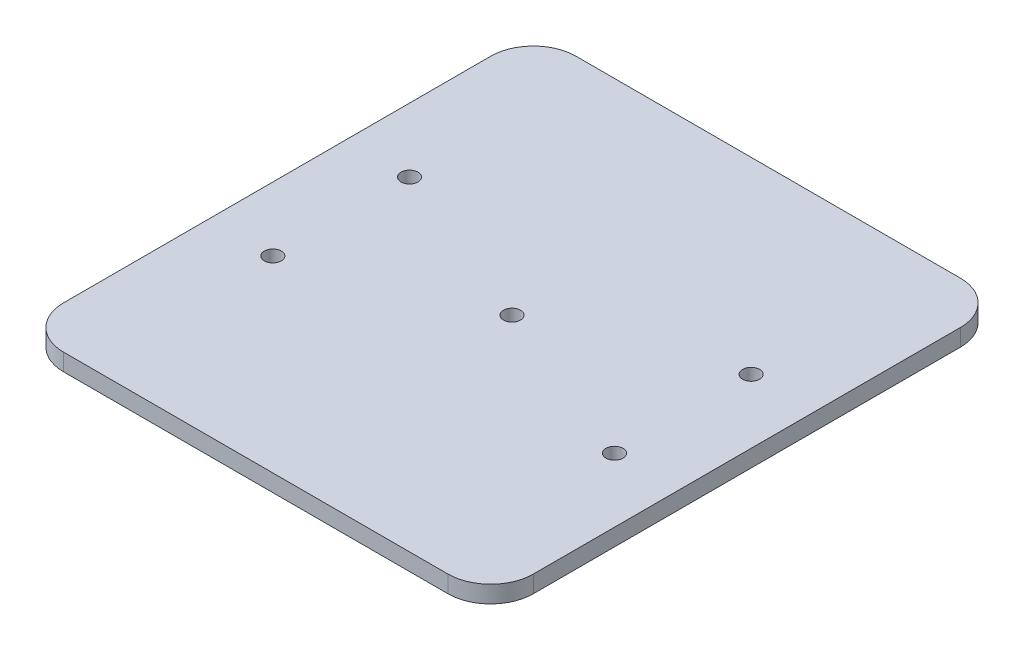
ISO-10303-21;
HEADER;
FILE_DESCRIPTION(('STEP AP214'),'2;1');
FILE_NAME('part.step','',(''),(''),'','','');
FILE_SCHEMA(('AUTOMOTIVE_DESIGN { 1 0 10303 214 1 1 1 1 }'));
ENDSEC;
DATA;
#1=APPLICATION_CONTEXT('core data for automotive mechanical design processes');
#2=APPLICATION_PROTOCOL_DEFINITION('international standard','automotive_design',2000,#1);
#3=PRODUCT_CONTEXT('',#1,'mechanical');
#4=PRODUCT('Part','Part','',(#3));
#5=PRODUCT_RELATED_PRODUCT_CATEGORY('part','',(#4));
#6=PRODUCT_DEFINITION_FORMATION('','',#4);
#7=PRODUCT_DEFINITION_CONTEXT('part definition',#1,'design');
#8=PRODUCT_DEFINITION('design','',#6,#7);
#9=PRODUCT_DEFINITION_SHAPE('','',#8);
#10=(LENGTH_UNIT() NAMED_UNIT(*) SI_UNIT(.MILLI.,.METRE.));
#11=(NAMED_UNIT(*) PLANE_ANGLE_UNIT() SI_UNIT($,.RADIAN.));
#12=(NAMED_UNIT(*) SI_UNIT($,.STERADIAN.) SOLID_ANGLE_UNIT());
#13=UNCERTAINTY_MEASURE_WITH_UNIT(LENGTH_MEASURE(1.E-05),#10,'distance_accuracy_value','');
#14=(GEOMETRIC_REPRESENTATION_CONTEXT(3) GLOBAL_UNCERTAINTY_ASSIGNED_CONTEXT((#13)) GLOBAL_UNIT_ASSIGNED_CONTEXT((#10,
#11,#12)) REPRESENTATION_CONTEXT('',''));
#15=CARTESIAN_POINT('',(0.,0.,0.));
#16=DIRECTION('',(0.,0.,1.));
#17=DIRECTION('',(1.,0.,0.));
#18=AXIS2_PLACEMENT_3D('',#15,#16,#17);
#19=CARTESIAN_POINT('',(8.19905213270141,2.,25.1421800947867));
#20=DIRECTION('',(0.,1.,0.));
#21=DIRECTION('',(0.,0.,1.));
#22=AXIS2_PLACEMENT_3D('',#19,#20,#21);
#23=PLANE('',#22);
#24=CARTESIAN_POINT('',(5.69905213270141,2.,-7.85781990521327));
#25=DIRECTION('',(0.,1.,0.));
#26=DIRECTION('',(0.,0.,1.));
#27=AXIS2_PLACEMENT_3D('',#24,#25,#26);
#28=CIRCLE('',#27,1.);
#29=CARTESIAN_POINT('',(5.69905213270141,2.,-6.85781990521327));
#30=VERTEX_POINT('',#29);
#31=EDGE_CURVE('E232',#30,#30,#28,.F.);
#32=ORIENTED_EDGE('',*,*,#31,.T.);
#33=EDGE_LOOP('',(#32));
#34=FACE_BOUND('',#33,.T.);
#35=CARTESIAN_POINT('',(5.69905213270141,2.,8.14218009478673));
#36=DIRECTION('',(0.,1.,0.));
#37=DIRECTION('',(0.,0.,1.));
#38=AXIS2_PLACEMENT_3D('',#35,#36,#37);
#39=CIRCLE('',#38,1.);
#40=CARTESIAN_POINT('',(5.69905213270141,2.,9.14218009478673));
#41=VERTEX_POINT('',#40);
#42=EDGE_CURVE('E239',#41,#41,#39,.F.);
#43=ORIENTED_EDGE('',*,*,#42,.T.);
#44=EDGE_LOOP('',(#43));
#45=FACE_BOUND('',#44,.T.);
#46=CARTESIAN_POINT('',(-34.3009478672986,2.,8.14218009478673));
#47=DIRECTION('',(0.,1.,0.));
#48=DIRECTION('',(0.,0.,1.));
#49=AXIS2_PLACEMENT_3D('',#46,#47,#48);
#50=CIRCLE('',#49,0.999999999999998);
#51=CARTESIAN_POINT('',(-34.3009478672986,2.,9.14218009478673));
#52=VERTEX_POINT('',#51);
#53=EDGE_CURVE('E216',#52,#52,#50,.T.);
#54=ORIENTED_EDGE('',*,*,#53,.F.);
#55=EDGE_LOOP('',(#54));
#56=FACE_BOUND('',#55,.T.);
#57=CARTESIAN_POINT('',(8.19905213270141,2.,25.1421800947867));
#58=DIRECTION('',(0.,1.,0.));
#59=DIRECTION('',(0.,0.,1.));
#60=AXIS2_PLACEMENT_3D('',#57,#58,#59);
#61=CIRCLE('',#60,5.);
#62=CARTESIAN_POINT('',(8.19905213270137,2.,30.1421800947867));
#63=VERTEX_POINT('',#62);
#64=CARTESIAN_POINT('',(13.1990521327014,2.,25.1421800947867));
#65=VERTEX_POINT('',#64);
#66=EDGE_CURVE('E167',#63,#65,#61,.T.);
#67=ORIENTED_EDGE('',*,*,#66,.T.);
#68=DIRECTION('',(0.,0.,-1.));
#69=VECTOR('',#68,1.);
#70=CARTESIAN_POINT('',(13.1990521327014,2.,-24.8578199052132));
#71=LINE('',#70,#69);
#72=CARTESIAN_POINT('',(13.1990521327014,2.,-24.8578199052132));
#73=VERTEX_POINT('',#72);
#74=EDGE_CURVE('E103',#65,#73,#71,.T.);
#75=ORIENTED_EDGE('',*,*,#74,.T.);
#76=CARTESIAN_POINT('',(8.19905213270141,2.,-24.8578199052133));
#77=DIRECTION('',(0.,1.,0.));
#78=DIRECTION('',(0.,0.,-1.));
#79=AXIS2_PLACEMENT_3D('',#76,#77,#78);
#80=CIRCLE('',#79,5.);
#81=CARTESIAN_POINT('',(8.19905213270137,2.,-29.8578199052133));
#82=VERTEX_POINT('',#81);
#83=EDGE_CURVE('E188',#73,#82,#80,.T.);
#84=ORIENTED_EDGE('',*,*,#83,.T.);
#85=DIRECTION('',(-1.,0.,0.));
#86=VECTOR('',#85,1.);
#87=CARTESIAN_POINT('',(-36.8009478672986,2.,-29.8578199052133));
#88=LINE('',#87,#86);
#89=CARTESIAN_POINT('',(-36.8009478672986,2.,-29.8578199052133));
#90=VERTEX_POINT('',#89);
#91=EDGE_CURVE('E202',#82,#90,#88,.T.);
#92=ORIENTED_EDGE('',*,*,#91,.T.);
#93=CARTESIAN_POINT('',(-36.8009478672986,2.,-24.8578199052133));
#94=DIRECTION('',(0.,1.,0.));
#95=DIRECTION('',(0.,0.,-1.));
#96=AXIS2_PLACEMENT_3D('',#93,#94,#95);
#97=CIRCLE('',#96,5.);
#98=CARTESIAN_POINT('',(-41.8009478672986,2.,-24.8578199052132));
#99=VERTEX_POINT('',#98);
#100=EDGE_CURVE('E122',#90,#99,#97,.T.);
#101=ORIENTED_EDGE('',*,*,#100,.T.);
#102=DIRECTION('',(0.,0.,1.));
#103=VECTOR('',#102,1.);
#104=CARTESIAN_POINT('',(-41.8009478672986,2.,-24.8578199052132));
#105=LINE('',#104,#103);
#106=CARTESIAN_POINT('',(-41.8009478672986,2.,25.1421800947867));
#107=VERTEX_POINT('',#106);
#108=EDGE_CURVE('E116',#99,#107,#105,.T.);
#109=ORIENTED_EDGE('',*,*,#108,.T.);
#110=CARTESIAN_POINT('',(-36.8009478672986,2.,25.1421800947867));
#111=DIRECTION('',(0.,1.,0.));
#112=DIRECTION('',(0.,0.,1.));
#113=AXIS2_PLACEMENT_3D('',#110,#111,#112);
#114=CIRCLE('',#113,5.);
#115=CARTESIAN_POINT('',(-36.8009478672986,2.,30.1421800947867));
#116=VERTEX_POINT('',#115);
#117=EDGE_CURVE('E120',#107,#116,#114,.T.);
#118=ORIENTED_EDGE('',*,*,#117,.T.);
#119=DIRECTION('',(1.,0.,0.));
#120=VECTOR('',#119,1.);
#121=CARTESIAN_POINT('',(-36.8009478672986,2.,30.1421800947867));
#122=LINE('',#121,#120);
#123=EDGE_CURVE('E60',#116,#63,#122,.T.);
#124=ORIENTED_EDGE('',*,*,#123,.T.);
#125=EDGE_LOOP('',(#67,#75,#84,#92,#101,#109,#118,#124));
#126=FACE_BOUND('',#125,.T.);
#127=CARTESIAN_POINT('',(-34.3009478672986,2.,-7.85781990521327));
#128=DIRECTION('',(0.,1.,0.));
#129=DIRECTION('',(0.,0.,1.));
#130=AXIS2_PLACEMENT_3D('',#127,#128,#129);
#131=CIRCLE('',#130,0.999999999999998);
#132=CARTESIAN_POINT('',(-34.3009478672986,2.,-6.85781990521327));
#133=VERTEX_POINT('',#132);
#134=EDGE_CURVE('E149',#133,#133,#131,.T.);
#135=ORIENTED_EDGE('',*,*,#134,.F.);
#136=EDGE_LOOP('',(#135));
#137=FACE_BOUND('',#136,.T.);
#138=CARTESIAN_POINT('',(-14.3009478672986,2.,0.142180094786729));
#139=DIRECTION('',(0.,1.,0.));
#140=DIRECTION('',(0.,0.,1.));
#141=AXIS2_PLACEMENT_3D('',#138,#139,#140);
#142=CIRCLE('',#141,1.);
#143=CARTESIAN_POINT('',(-14.3009478672986,2.,1.14218009478673));
#144=VERTEX_POINT('',#143);
#145=EDGE_CURVE('E224',#144,#144,#142,.T.);
#146=ORIENTED_EDGE('',*,*,#145,.F.);
#147=EDGE_LOOP('',(#146));
#148=FACE_BOUND('',#147,.T.);
#149=ADVANCED_FACE('F42',(#34,#45,#56,#126,#137,#148),#23,.T.);
#150=CARTESIAN_POINT('',(8.19905213270141,0.,25.1421800947867));
#151=DIRECTION('',(0.,1.,0.));
#152=DIRECTION('',(0.,0.,1.));
#153=AXIS2_PLACEMENT_3D('',#150,#151,#152);
#154=PLANE('',#153);
#155=CARTESIAN_POINT('',(5.69905213270141,0.,-7.85781990521327));
#156=DIRECTION('',(0.,1.,0.));
#157=DIRECTION('',(0.,0.,1.));
#158=AXIS2_PLACEMENT_3D('',#155,#156,#157);
#159=CIRCLE('',#158,1.);
#160=CARTESIAN_POINT('',(5.69905213270141,0.,-6.85781990521327));
#161=VERTEX_POINT('',#160);
#162=EDGE_CURVE('E243',#161,#161,#159,.T.);
#163=ORIENTED_EDGE('',*,*,#162,.T.);
#164=EDGE_LOOP('',(#163));
#165=FACE_BOUND('',#164,.T.);
#166=CARTESIAN_POINT('',(5.69905213270141,0.,8.14218009478673));
#167=DIRECTION('',(0.,1.,0.));
#168=DIRECTION('',(0.,0.,1.));
#169=AXIS2_PLACEMENT_3D('',#166,#167,#168);
#170=CIRCLE('',#169,1.);
#171=CARTESIAN_POINT('',(5.69905213270141,0.,9.14218009478673));
#172=VERTEX_POINT('',#171);
#173=EDGE_CURVE('E244',#172,#172,#170,.T.);
#174=ORIENTED_EDGE('',*,*,#173,.T.);
#175=EDGE_LOOP('',(#174));
#176=FACE_BOUND('',#175,.T.);
#177=CARTESIAN_POINT('',(8.19905213270141,0.,25.1421800947867));
#178=DIRECTION('',(0.,1.,0.));
#179=DIRECTION('',(0.,0.,1.));
#180=AXIS2_PLACEMENT_3D('',#177,#178,#179);
#181=CIRCLE('',#180,5.);
#182=CARTESIAN_POINT('',(8.19905213270137,0.,30.1421800947867));
#183=VERTEX_POINT('',#182);
#184=CARTESIAN_POINT('',(13.1990521327014,0.,25.1421800947867));
#185=VERTEX_POINT('',#184);
#186=EDGE_CURVE('E144',#183,#185,#181,.T.);
#187=ORIENTED_EDGE('',*,*,#186,.F.);
#188=DIRECTION('',(1.,0.,0.));
#189=VECTOR('',#188,1.);
#190=CARTESIAN_POINT('',(-36.8009478672986,0.,30.1421800947867));
#191=LINE('',#190,#189);
#192=CARTESIAN_POINT('',(-36.8009478672986,0.,30.1421800947867));
#193=VERTEX_POINT('',#192);
#194=EDGE_CURVE('E95',#193,#183,#191,.T.);
#195=ORIENTED_EDGE('',*,*,#194,.F.);
#196=CARTESIAN_POINT('',(-36.8009478672986,0.,25.1421800947867));
#197=DIRECTION('',(0.,1.,0.));
#198=DIRECTION('',(0.,0.,1.));
#199=AXIS2_PLACEMENT_3D('',#196,#197,#198);
#200=CIRCLE('',#199,5.);
#201=CARTESIAN_POINT('',(-41.8009478672986,0.,25.1421800947867));
#202=VERTEX_POINT('',#201);
#203=EDGE_CURVE('E89',#202,#193,#200,.T.);
#204=ORIENTED_EDGE('',*,*,#203,.F.);
#205=DIRECTION('',(0.,0.,1.));
#206=VECTOR('',#205,1.);
#207=CARTESIAN_POINT('',(-41.8009478672986,0.,-24.8578199052132));
#208=LINE('',#207,#206);
#209=CARTESIAN_POINT('',(-41.8009478672986,0.,-24.8578199052132));
#210=VERTEX_POINT('',#209);
#211=EDGE_CURVE('E131',#210,#202,#208,.T.);
#212=ORIENTED_EDGE('',*,*,#211,.F.);
#213=CARTESIAN_POINT('',(-36.8009478672986,0.,-24.8578199052133));
#214=DIRECTION('',(0.,1.,0.));
#215=DIRECTION('',(0.,0.,-1.));
#216=AXIS2_PLACEMENT_3D('',#213,#214,#215);
#217=CIRCLE('',#216,5.);
#218=CARTESIAN_POINT('',(-36.8009478672986,0.,-29.8578199052133));
#219=VERTEX_POINT('',#218);
#220=EDGE_CURVE('E158',#219,#210,#217,.T.);
#221=ORIENTED_EDGE('',*,*,#220,.F.);
#222=DIRECTION('',(-1.,0.,0.));
#223=VECTOR('',#222,1.);
#224=CARTESIAN_POINT('',(-36.8009478672986,0.,-29.8578199052133));
#225=LINE('',#224,#223);
#226=CARTESIAN_POINT('',(8.19905213270137,0.,-29.8578199052133));
#227=VERTEX_POINT('',#226);
#228=EDGE_CURVE('E155',#227,#219,#225,.T.);
#229=ORIENTED_EDGE('',*,*,#228,.F.);
#230=CARTESIAN_POINT('',(8.19905213270141,0.,-24.8578199052133));
#231=DIRECTION('',(0.,1.,0.));
#232=DIRECTION('',(0.,0.,-1.));
#233=AXIS2_PLACEMENT_3D('',#230,#231,#232);
#234=CIRCLE('',#233,5.);
#235=CARTESIAN_POINT('',(13.1990521327014,0.,-24.8578199052132));
#236=VERTEX_POINT('',#235);
#237=EDGE_CURVE('E152',#236,#227,#234,.T.);
#238=ORIENTED_EDGE('',*,*,#237,.F.);
#239=DIRECTION('',(0.,0.,-1.));
#240=VECTOR('',#239,1.);
#241=CARTESIAN_POINT('',(13.1990521327014,0.,-24.8578199052132));
#242=LINE('',#241,#240);
#243=EDGE_CURVE('E148',#185,#236,#242,.T.);
#244=ORIENTED_EDGE('',*,*,#243,.F.);
#245=EDGE_LOOP('',(#187,#195,#204,#212,#221,#229,#238,#244));
#246=FACE_BOUND('',#245,.T.);
#247=CARTESIAN_POINT('',(-34.3009478672986,0.,-7.85781990521327));
#248=DIRECTION('',(0.,1.,0.));
#249=DIRECTION('',(0.,0.,1.));
#250=AXIS2_PLACEMENT_3D('',#247,#248,#249);
#251=CIRCLE('',#250,0.999999999999998);
#252=CARTESIAN_POINT('',(-34.3009478672986,0.,-6.85781990521327));
#253=VERTEX_POINT('',#252);
#254=EDGE_CURVE('E212',#253,#253,#251,.T.);
#255=ORIENTED_EDGE('',*,*,#254,.T.);
#256=EDGE_LOOP('',(#255));
#257=FACE_BOUND('',#256,.T.);
#258=CARTESIAN_POINT('',(-34.3009478672986,0.,8.14218009478673));
#259=DIRECTION('',(0.,1.,0.));
#260=DIRECTION('',(0.,0.,1.));
#261=AXIS2_PLACEMENT_3D('',#258,#259,#260);
#262=CIRCLE('',#261,0.999999999999998);
#263=CARTESIAN_POINT('',(-34.3009478672986,0.,9.14218009478673));
#264=VERTEX_POINT('',#263);
#265=EDGE_CURVE('E220',#264,#264,#262,.T.);
#266=ORIENTED_EDGE('',*,*,#265,.T.);
#267=EDGE_LOOP('',(#266));
#268=FACE_BOUND('',#267,.T.);
#269=CARTESIAN_POINT('',(-14.3009478672986,0.,0.142180094786729));
#270=DIRECTION('',(0.,1.,0.));
#271=DIRECTION('',(0.,0.,1.));
#272=AXIS2_PLACEMENT_3D('',#269,#270,#271);
#273=CIRCLE('',#272,1.);
#274=CARTESIAN_POINT('',(-14.3009478672986,0.,1.14218009478673));
#275=VERTEX_POINT('',#274);
#276=EDGE_CURVE('E228',#275,#275,#273,.T.);
#277=ORIENTED_EDGE('',*,*,#276,.T.);
#278=EDGE_LOOP('',(#277));
#279=FACE_BOUND('',#278,.T.);
#280=ADVANCED_FACE('F192',(#165,#176,#246,#257,#268,#279),#154,.F.);
#281=CARTESIAN_POINT('',(8.19905213270141,2.,25.1421800947867));
#282=DIRECTION('',(0.,-1.,0.));
#283=DIRECTION('',(0.,0.,-1.));
#284=AXIS2_PLACEMENT_3D('',#281,#282,#283);
#285=CYLINDRICAL_SURFACE('',#284,5.);
#286=ORIENTED_EDGE('',*,*,#186,.T.);
#287=DIRECTION('',(0.,-1.,0.));
#288=VECTOR('',#287,1.);
#289=CARTESIAN_POINT('',(13.1990521327014,2.,25.1421800947867));
#290=LINE('',#289,#288);
#291=EDGE_CURVE('E11',#65,#185,#290,.T.);
#292=ORIENTED_EDGE('',*,*,#291,.F.);
#293=ORIENTED_EDGE('',*,*,#66,.F.);
#294=DIRECTION('',(0.,-1.,0.));
#295=VECTOR('',#294,1.);
#296=CARTESIAN_POINT('',(8.19905213270137,2.,30.1421800947867));
#297=LINE('',#296,#295);
#298=EDGE_CURVE('E140',#63,#183,#297,.T.);
#299=ORIENTED_EDGE('',*,*,#298,.T.);
#300=EDGE_LOOP('',(#286,#292,#293,#299));
#301=FACE_BOUND('',#300,.T.);
#302=ADVANCED_FACE('F44',(#301),#285,.T.);
#303=CARTESIAN_POINT('',(13.1990521327014,2.,-24.8578199052132));
#304=DIRECTION('',(-1.,0.,0.));
#305=DIRECTION('',(0.,0.,1.));
#306=AXIS2_PLACEMENT_3D('',#303,#304,#305);
#307=PLANE('',#306);
#308=ORIENTED_EDGE('',*,*,#243,.T.);
#309=DIRECTION('',(0.,-1.,0.));
#310=VECTOR('',#309,1.);
#311=CARTESIAN_POINT('',(13.1990521327014,2.,-24.8578199052132));
#312=LINE('',#311,#310);
#313=EDGE_CURVE('E52',#73,#236,#312,.T.);
#314=ORIENTED_EDGE('',*,*,#313,.F.);
#315=ORIENTED_EDGE('',*,*,#74,.F.);
#316=ORIENTED_EDGE('',*,*,#291,.T.);
#317=EDGE_LOOP('',(#308,#314,#315,#316));
#318=FACE_BOUND('',#317,.T.);
#319=ADVANCED_FACE('F291',(#318),#307,.F.);
#320=CARTESIAN_POINT('',(8.19905213270141,2.,-24.8578199052133));
#321=DIRECTION('',(0.,-1.,0.));
#322=DIRECTION('',(0.,0.,-1.));
#323=AXIS2_PLACEMENT_3D('',#320,#321,#322);
#324=CYLINDRICAL_SURFACE('',#323,5.);
#325=ORIENTED_EDGE('',*,*,#237,.T.);
#326=DIRECTION('',(0.,-1.,0.));
#327=VECTOR('',#326,1.);
#328=CARTESIAN_POINT('',(8.19905213270137,2.,-29.8578199052133));
#329=LINE('',#328,#327);
#330=EDGE_CURVE('E178',#82,#227,#329,.T.);
#331=ORIENTED_EDGE('',*,*,#330,.F.);
#332=ORIENTED_EDGE('',*,*,#83,.F.);
#333=ORIENTED_EDGE('',*,*,#313,.T.);
#334=EDGE_LOOP('',(#325,#331,#332,#333));
#335=FACE_BOUND('',#334,.T.);
#336=ADVANCED_FACE('F186',(#335),#324,.T.);
#337=CARTESIAN_POINT('',(-36.8009478672986,2.,-29.8578199052133));
#338=DIRECTION('',(0.,0.,1.));
#339=DIRECTION('',(1.,0.,0.));
#340=AXIS2_PLACEMENT_3D('',#337,#338,#339);
#341=PLANE('',#340);
#342=ORIENTED_EDGE('',*,*,#228,.T.);
#343=DIRECTION('',(0.,-1.,0.));
#344=VECTOR('',#343,1.);
#345=CARTESIAN_POINT('',(-36.8009478672986,2.,-29.8578199052133));
#346=LINE('',#345,#344);
#347=EDGE_CURVE('E174',#90,#219,#346,.T.);
#348=ORIENTED_EDGE('',*,*,#347,.F.);
#349=ORIENTED_EDGE('',*,*,#91,.F.);
#350=ORIENTED_EDGE('',*,*,#330,.T.);
#351=EDGE_LOOP('',(#342,#348,#349,#350));
#352=FACE_BOUND('',#351,.T.);
#353=ADVANCED_FACE('F197',(#352),#341,.F.);
#354=CARTESIAN_POINT('',(-36.8009478672986,2.,-24.8578199052133));
#355=DIRECTION('',(0.,-1.,0.));
#356=DIRECTION('',(0.,0.,-1.));
#357=AXIS2_PLACEMENT_3D('',#354,#355,#356);
#358=CYLINDRICAL_SURFACE('',#357,5.);
#359=ORIENTED_EDGE('',*,*,#220,.T.);
#360=DIRECTION('',(0.,-1.,0.));
#361=VECTOR('',#360,1.);
#362=CARTESIAN_POINT('',(-41.8009478672986,2.,-24.8578199052132));
#363=LINE('',#362,#361);
#364=EDGE_CURVE('E133',#99,#210,#363,.T.);
#365=ORIENTED_EDGE('',*,*,#364,.F.);
#366=ORIENTED_EDGE('',*,*,#100,.F.);
#367=ORIENTED_EDGE('',*,*,#347,.T.);
#368=EDGE_LOOP('',(#359,#365,#366,#367));
#369=FACE_BOUND('',#368,.T.);
#370=ADVANCED_FACE('F200',(#369),#358,.T.);
#371=CARTESIAN_POINT('',(-41.8009478672986,2.,-24.8578199052132));
#372=DIRECTION('',(1.,0.,0.));
#373=DIRECTION('',(0.,0.,-1.));
#374=AXIS2_PLACEMENT_3D('',#371,#372,#373);
#375=PLANE('',#374);
#376=ORIENTED_EDGE('',*,*,#211,.T.);
#377=DIRECTION('',(0.,-1.,0.));
#378=VECTOR('',#377,1.);
#379=CARTESIAN_POINT('',(-41.8009478672986,2.,25.1421800947867));
#380=LINE('',#379,#378);
#381=EDGE_CURVE('E128',#107,#202,#380,.T.);
#382=ORIENTED_EDGE('',*,*,#381,.F.);
#383=ORIENTED_EDGE('',*,*,#108,.F.);
#384=ORIENTED_EDGE('',*,*,#364,.T.);
#385=EDGE_LOOP('',(#376,#382,#383,#384));
#386=FACE_BOUND('',#385,.T.);
#387=ADVANCED_FACE('F129',(#386),#375,.F.);
#388=CARTESIAN_POINT('',(-36.8009478672986,2.,25.1421800947867));
#389=DIRECTION('',(0.,-1.,0.));
#390=DIRECTION('',(0.,0.,-1.));
#391=AXIS2_PLACEMENT_3D('',#388,#389,#390);
#392=CYLINDRICAL_SURFACE('',#391,5.);
#393=ORIENTED_EDGE('',*,*,#203,.T.);
#394=DIRECTION('',(0.,-1.,0.));
#395=VECTOR('',#394,1.);
#396=CARTESIAN_POINT('',(-36.8009478672986,2.,30.1421800947867));
#397=LINE('',#396,#395);
#398=EDGE_CURVE('E134',#116,#193,#397,.T.);
#399=ORIENTED_EDGE('',*,*,#398,.F.);
#400=ORIENTED_EDGE('',*,*,#117,.F.);
#401=ORIENTED_EDGE('',*,*,#381,.T.);
#402=EDGE_LOOP('',(#393,#399,#400,#401));
#403=FACE_BOUND('',#402,.T.);
#404=ADVANCED_FACE('F136',(#403),#392,.T.);
#405=CARTESIAN_POINT('',(-36.8009478672986,2.,30.1421800947867));
#406=DIRECTION('',(0.,0.,-1.));
#407=DIRECTION('',(-1.,0.,0.));
#408=AXIS2_PLACEMENT_3D('',#405,#406,#407);
#409=PLANE('',#408);
#410=ORIENTED_EDGE('',*,*,#194,.T.);
#411=ORIENTED_EDGE('',*,*,#298,.F.);
#412=ORIENTED_EDGE('',*,*,#123,.F.);
#413=ORIENTED_EDGE('',*,*,#398,.T.);
#414=EDGE_LOOP('',(#410,#411,#412,#413));
#415=FACE_BOUND('',#414,.T.);
#416=ADVANCED_FACE('F279',(#415),#409,.F.);
#417=CARTESIAN_POINT('',(-34.3009478672986,2.,-7.85781990521327));
#418=DIRECTION('',(0.,-1.,0.));
#419=DIRECTION('',(0.,0.,-1.));
#420=AXIS2_PLACEMENT_3D('',#417,#418,#419);
#421=CYLINDRICAL_SURFACE('',#420,0.999999999999998);
#422=ORIENTED_EDGE('',*,*,#134,.T.);
#423=EDGE_LOOP('',(#422));
#424=FACE_BOUND('',#423,.T.);
#425=ORIENTED_EDGE('',*,*,#254,.F.);
#426=EDGE_LOOP('',(#425));
#427=FACE_BOUND('',#426,.T.);
#428=ADVANCED_FACE('F276',(#424,#427),#421,.F.);
#429=CARTESIAN_POINT('',(-34.3009478672986,2.,8.14218009478673));
#430=DIRECTION('',(0.,-1.,0.));
#431=DIRECTION('',(0.,0.,-1.));
#432=AXIS2_PLACEMENT_3D('',#429,#430,#431);
#433=CYLINDRICAL_SURFACE('',#432,0.999999999999998);
#434=ORIENTED_EDGE('',*,*,#53,.T.);
#435=EDGE_LOOP('',(#434));
#436=FACE_BOUND('',#435,.T.);
#437=ORIENTED_EDGE('',*,*,#265,.F.);
#438=EDGE_LOOP('',(#437));
#439=FACE_BOUND('',#438,.T.);
#440=ADVANCED_FACE('F368',(#436,#439),#433,.F.);
#441=CARTESIAN_POINT('',(-14.3009478672986,2.,0.142180094786729));
#442=DIRECTION('',(0.,-1.,0.));
#443=DIRECTION('',(0.,0.,-1.));
#444=AXIS2_PLACEMENT_3D('',#441,#442,#443);
#445=CYLINDRICAL_SURFACE('',#444,1.);
#446=ORIENTED_EDGE('',*,*,#145,.T.);
#447=EDGE_LOOP('',(#446));
#448=FACE_BOUND('',#447,.T.);
#449=ORIENTED_EDGE('',*,*,#276,.F.);
#450=EDGE_LOOP('',(#449));
#451=FACE_BOUND('',#450,.T.);
#452=ADVANCED_FACE('F262',(#448,#451),#445,.F.);
#453=CARTESIAN_POINT('',(5.69905213270141,9.,8.14218009478673));
#454=DIRECTION('',(0.,-1.,0.));
#455=DIRECTION('',(0.,0.,-1.));
#456=AXIS2_PLACEMENT_3D('',#453,#454,#455);
#457=CYLINDRICAL_SURFACE('',#456,1.);
#458=ORIENTED_EDGE('',*,*,#42,.F.);
#459=EDGE_LOOP('',(#458));
#460=FACE_BOUND('',#459,.T.);
#461=ORIENTED_EDGE('',*,*,#173,.F.);
#462=EDGE_LOOP('',(#461));
#463=FACE_BOUND('',#462,.T.);
#464=ADVANCED_FACE('F256',(#460,#463),#457,.F.);
#465=CARTESIAN_POINT('',(5.69905213270141,9.,-7.85781990521327));
#466=DIRECTION('',(0.,-1.,0.));
#467=DIRECTION('',(0.,0.,-1.));
#468=AXIS2_PLACEMENT_3D('',#465,#466,#467);
#469=CYLINDRICAL_SURFACE('',#468,1.);
#470=ORIENTED_EDGE('',*,*,#31,.F.);
#471=EDGE_LOOP('',(#470));
#472=FACE_BOUND('',#471,.T.);
#473=ORIENTED_EDGE('',*,*,#162,.F.);
#474=EDGE_LOOP('',(#473));
#475=FACE_BOUND('',#474,.T.);
#476=ADVANCED_FACE('F254',(#472,#475),#469,.F.);
#477=CLOSED_SHELL('',(#149,#280,#302,#319,#336,#353,#370,#387,#404,#416,#428,#440,#452,#464,#476));
#478=MANIFOLD_SOLID_BREP('B2',#477);
#479=ADVANCED_BREP_SHAPE_REPRESENTATION('',(#18,#478),#14);
#480=SHAPE_DEFINITION_REPRESENTATION(#9,#479);
ENDSEC;
END-ISO-10303-21;
